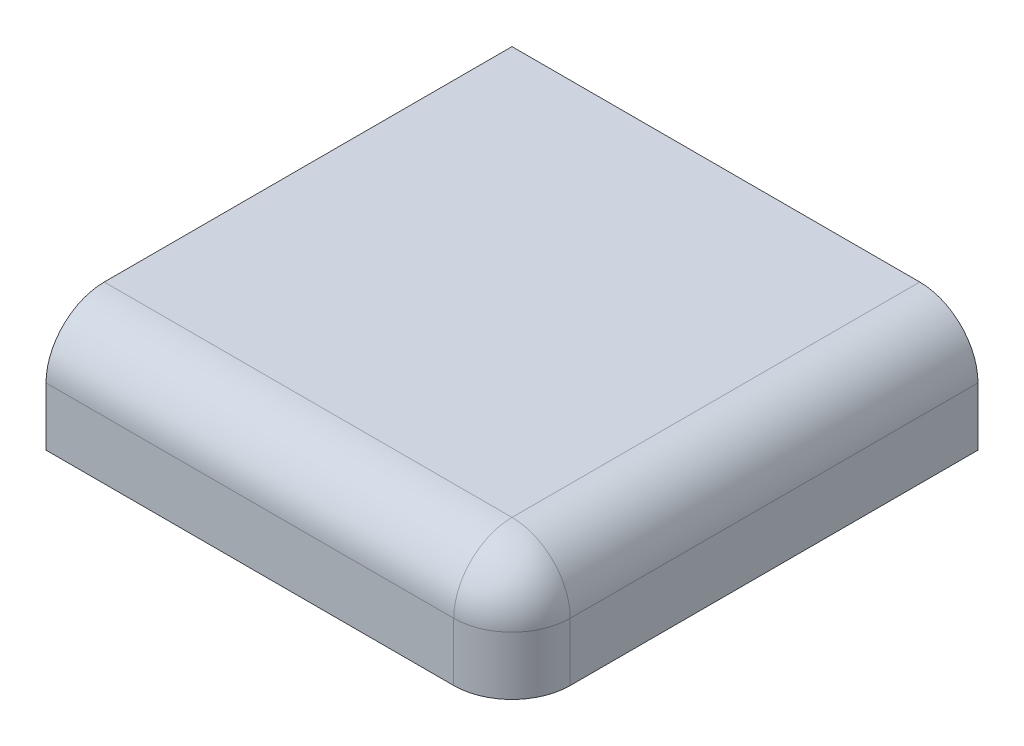
ISO-10303-21;
HEADER;
FILE_DESCRIPTION(('STEP AP214'),'2;1');
FILE_NAME('part.step','',(''),(''),'','','');
FILE_SCHEMA(('AUTOMOTIVE_DESIGN { 1 0 10303 214 1 1 1 1 }'));
ENDSEC;
DATA;
#1=APPLICATION_CONTEXT('core data for automotive mechanical design processes');
#2=APPLICATION_PROTOCOL_DEFINITION('international standard','automotive_design',2000,#1);
#3=PRODUCT_CONTEXT('',#1,'mechanical');
#4=PRODUCT('Part','Part','',(#3));
#5=PRODUCT_RELATED_PRODUCT_CATEGORY('part','',(#4));
#6=PRODUCT_DEFINITION_FORMATION('','',#4);
#7=PRODUCT_DEFINITION_CONTEXT('part definition',#1,'design');
#8=PRODUCT_DEFINITION('design','',#6,#7);
#9=PRODUCT_DEFINITION_SHAPE('','',#8);
#10=(LENGTH_UNIT() NAMED_UNIT(*) SI_UNIT(.MILLI.,.METRE.));
#11=(NAMED_UNIT(*) PLANE_ANGLE_UNIT() SI_UNIT($,.RADIAN.));
#12=(NAMED_UNIT(*) SI_UNIT($,.STERADIAN.) SOLID_ANGLE_UNIT());
#13=UNCERTAINTY_MEASURE_WITH_UNIT(LENGTH_MEASURE(1.E-05),#10,'distance_accuracy_value','');
#14=(GEOMETRIC_REPRESENTATION_CONTEXT(3) GLOBAL_UNCERTAINTY_ASSIGNED_CONTEXT((#13)) GLOBAL_UNIT_ASSIGNED_CONTEXT((#10,
#11,#12)) REPRESENTATION_CONTEXT('',''));
#15=CARTESIAN_POINT('',(0.,0.,0.));
#16=DIRECTION('',(0.,0.,1.));
#17=DIRECTION('',(1.,0.,0.));
#18=AXIS2_PLACEMENT_3D('',#15,#16,#17);
#19=CARTESIAN_POINT('',(-20.,-10.,20.));
#20=DIRECTION('',(-1.,0.,0.));
#21=DIRECTION('',(0.,0.,1.));
#22=AXIS2_PLACEMENT_3D('',#19,#20,#21);
#23=PLANE('',#22);
#24=CARTESIAN_POINT('',(-20.,-5.19917694316328,0.));
#25=DIRECTION('',(-1.,0.,0.));
#26=DIRECTION('',(0.,0.,1.));
#27=AXIS2_PLACEMENT_3D('',#24,#25,#26);
#28=CIRCLE('',#27,2.575);
#29=CARTESIAN_POINT('',(-20.,-2.96916152841835,-1.28749999999999));
#30=VERTEX_POINT('',#29);
#31=CARTESIAN_POINT('',(-20.,-2.96916152841835,1.28749999999999));
#32=VERTEX_POINT('',#31);
#33=EDGE_CURVE('E160',#30,#32,#28,.T.);
#34=ORIENTED_EDGE('',*,*,#33,.F.);
#35=DIRECTION('',(0.,-0.499999999999997,-0.86602540378444));
#36=VECTOR('',#35,1.);
#37=CARTESIAN_POINT('',(-20.,-1.66936729262754,0.963809655774862));
#38=LINE('',#37,#36);
#39=CARTESIAN_POINT('',(-20.,-2.22582305683672,0.));
#40=VERTEX_POINT('',#39);
#41=EDGE_CURVE('E166',#40,#30,#38,.T.);
#42=ORIENTED_EDGE('',*,*,#41,.F.);
#43=DIRECTION('',(0.,-0.499999999999997,0.866025403784441));
#44=VECTOR('',#43,1.);
#45=CARTESIAN_POINT('',(-20.,-1.66936729262755,-0.963809655774862));
#46=LINE('',#45,#44);
#47=EDGE_CURVE('E173',#40,#32,#46,.T.);
#48=ORIENTED_EDGE('',*,*,#47,.T.);
#49=EDGE_LOOP('',(#34,#42,#48));
#50=FACE_BOUND('',#49,.T.);
#51=DIRECTION('',(0.,1.,0.));
#52=VECTOR('',#51,1.);
#53=CARTESIAN_POINT('',(-20.,-10.,20.));
#54=LINE('',#53,#52);
#55=CARTESIAN_POINT('',(-20.,-10.,20.));
#56=VERTEX_POINT('',#55);
#57=CARTESIAN_POINT('',(-20.,-5.,20.));
#58=VERTEX_POINT('',#57);
#59=EDGE_CURVE('E197',#56,#58,#54,.T.);
#60=ORIENTED_EDGE('',*,*,#59,.T.);
#61=CARTESIAN_POINT('',(-20.,-5.,15.));
#62=DIRECTION('',(-1.,0.,0.));
#63=DIRECTION('',(0.,0.,1.));
#64=AXIS2_PLACEMENT_3D('',#61,#62,#63);
#65=CIRCLE('',#64,5.);
#66=CARTESIAN_POINT('',(-20.,0.,15.));
#67=VERTEX_POINT('',#66);
#68=EDGE_CURVE('E217',#58,#67,#65,.T.);
#69=ORIENTED_EDGE('',*,*,#68,.T.);
#70=DIRECTION('',(0.,0.,1.));
#71=VECTOR('',#70,1.);
#72=CARTESIAN_POINT('',(-20.,0.,20.));
#73=LINE('',#72,#71);
#74=CARTESIAN_POINT('',(-20.,0.,-20.));
#75=VERTEX_POINT('',#74);
#76=EDGE_CURVE('E180',#75,#67,#73,.T.);
#77=ORIENTED_EDGE('',*,*,#76,.F.);
#78=DIRECTION('',(0.,1.,0.));
#79=VECTOR('',#78,1.);
#80=CARTESIAN_POINT('',(-20.,-10.,-20.));
#81=LINE('',#80,#79);
#82=CARTESIAN_POINT('',(-20.,-10.,-20.));
#83=VERTEX_POINT('',#82);
#84=EDGE_CURVE('E201',#83,#75,#81,.T.);
#85=ORIENTED_EDGE('',*,*,#84,.F.);
#86=DIRECTION('',(0.,0.,1.));
#87=VECTOR('',#86,1.);
#88=CARTESIAN_POINT('',(-20.,-10.,20.));
#89=LINE('',#88,#87);
#90=EDGE_CURVE('E185',#83,#56,#89,.T.);
#91=ORIENTED_EDGE('',*,*,#90,.T.);
#92=EDGE_LOOP('',(#60,#69,#77,#85,#91));
#93=FACE_BOUND('',#92,.T.);
#94=ADVANCED_FACE('F37',(#50,#93),#23,.T.);
#95=CARTESIAN_POINT('',(-20.,-10.,-20.));
#96=DIRECTION('',(0.,0.,-1.));
#97=DIRECTION('',(-1.,0.,0.));
#98=AXIS2_PLACEMENT_3D('',#95,#96,#97);
#99=PLANE('',#98);
#100=CARTESIAN_POINT('',(0.,-5.19917694316328,-20.));
#101=DIRECTION('',(0.,0.,-1.));
#102=DIRECTION('',(-1.,0.,0.));
#103=AXIS2_PLACEMENT_3D('',#100,#101,#102);
#104=CIRCLE('',#103,2.575);
#105=CARTESIAN_POINT('',(1.28750000000006,-2.96916152841835,-20.));
#106=VERTEX_POINT('',#105);
#107=CARTESIAN_POINT('',(-1.28749999999993,-2.96916152841835,-20.));
#108=VERTEX_POINT('',#107);
#109=EDGE_CURVE('E146',#106,#108,#104,.T.);
#110=ORIENTED_EDGE('',*,*,#109,.F.);
#111=DIRECTION('',(0.86602540378444,-0.499999999999997,0.));
#112=VECTOR('',#111,1.);
#113=CARTESIAN_POINT('',(-0.963809655774792,-1.66936729262754,-20.));
#114=LINE('',#113,#112);
#115=CARTESIAN_POINT('',(0.,-2.22582305683672,-20.));
#116=VERTEX_POINT('',#115);
#117=EDGE_CURVE('E149',#116,#106,#114,.T.);
#118=ORIENTED_EDGE('',*,*,#117,.F.);
#119=DIRECTION('',(-0.866025403784441,-0.499999999999997,0.));
#120=VECTOR('',#119,1.);
#121=CARTESIAN_POINT('',(0.963809655774932,-1.66936729262755,-20.));
#122=LINE('',#121,#120);
#123=EDGE_CURVE('E152',#116,#108,#122,.T.);
#124=ORIENTED_EDGE('',*,*,#123,.T.);
#125=EDGE_LOOP('',(#110,#118,#124));
#126=FACE_BOUND('',#125,.T.);
#127=DIRECTION('',(-1.,0.,0.));
#128=VECTOR('',#127,1.);
#129=CARTESIAN_POINT('',(-20.,0.,-20.));
#130=LINE('',#129,#128);
#131=CARTESIAN_POINT('',(15.,0.,-20.));
#132=VERTEX_POINT('',#131);
#133=EDGE_CURVE('E189',#132,#75,#130,.T.);
#134=ORIENTED_EDGE('',*,*,#133,.F.);
#135=CARTESIAN_POINT('',(15.,-5.,-20.));
#136=DIRECTION('',(0.,0.,-1.));
#137=DIRECTION('',(-1.,0.,0.));
#138=AXIS2_PLACEMENT_3D('',#135,#136,#137);
#139=CIRCLE('',#138,5.);
#140=CARTESIAN_POINT('',(20.,-5.,-20.));
#141=VERTEX_POINT('',#140);
#142=EDGE_CURVE('E219',#132,#141,#139,.T.);
#143=ORIENTED_EDGE('',*,*,#142,.T.);
#144=DIRECTION('',(0.,1.,0.));
#145=VECTOR('',#144,1.);
#146=CARTESIAN_POINT('',(20.,-10.,-20.));
#147=LINE('',#146,#145);
#148=CARTESIAN_POINT('',(20.,-10.,-20.));
#149=VERTEX_POINT('',#148);
#150=EDGE_CURVE('E205',#149,#141,#147,.T.);
#151=ORIENTED_EDGE('',*,*,#150,.F.);
#152=DIRECTION('',(-1.,0.,0.));
#153=VECTOR('',#152,1.);
#154=CARTESIAN_POINT('',(-20.,-10.,-20.));
#155=LINE('',#154,#153);
#156=EDGE_CURVE('E194',#149,#83,#155,.T.);
#157=ORIENTED_EDGE('',*,*,#156,.T.);
#158=ORIENTED_EDGE('',*,*,#84,.T.);
#159=EDGE_LOOP('',(#134,#143,#151,#157,#158));
#160=FACE_BOUND('',#159,.T.);
#161=ADVANCED_FACE('F255',(#126,#160),#99,.T.);
#162=CARTESIAN_POINT('',(20.,-10.,20.));
#163=DIRECTION('',(1.,0.,0.));
#164=DIRECTION('',(0.,0.,-1.));
#165=AXIS2_PLACEMENT_3D('',#162,#163,#164);
#166=PLANE('',#165);
#167=ORIENTED_EDGE('',*,*,#150,.T.);
#168=DIRECTION('',(0.,0.,-1.));
#169=VECTOR('',#168,1.);
#170=CARTESIAN_POINT('',(20.,-5.,20.));
#171=LINE('',#170,#169);
#172=CARTESIAN_POINT('',(20.,-5.,15.));
#173=VERTEX_POINT('',#172);
#174=EDGE_CURVE('E46',#141,#173,#171,.F.);
#175=ORIENTED_EDGE('',*,*,#174,.T.);
#176=DIRECTION('',(0.,1.,0.));
#177=VECTOR('',#176,1.);
#178=CARTESIAN_POINT('',(20.,-10.,15.));
#179=LINE('',#178,#177);
#180=CARTESIAN_POINT('',(20.,-10.,15.));
#181=VERTEX_POINT('',#180);
#182=EDGE_CURVE('E57',#173,#181,#179,.F.);
#183=ORIENTED_EDGE('',*,*,#182,.T.);
#184=DIRECTION('',(0.,0.,-1.));
#185=VECTOR('',#184,1.);
#186=CARTESIAN_POINT('',(20.,-10.,20.));
#187=LINE('',#186,#185);
#188=EDGE_CURVE('E192',#181,#149,#187,.T.);
#189=ORIENTED_EDGE('',*,*,#188,.T.);
#190=EDGE_LOOP('',(#167,#175,#183,#189));
#191=FACE_BOUND('',#190,.T.);
#192=ADVANCED_FACE('F256',(#191),#166,.T.);
#193=CARTESIAN_POINT('',(-20.,-10.,20.));
#194=DIRECTION('',(0.,0.,1.));
#195=DIRECTION('',(1.,0.,0.));
#196=AXIS2_PLACEMENT_3D('',#193,#194,#195);
#197=PLANE('',#196);
#198=DIRECTION('',(0.,1.,0.));
#199=VECTOR('',#198,1.);
#200=CARTESIAN_POINT('',(15.,-10.,20.));
#201=LINE('',#200,#199);
#202=CARTESIAN_POINT('',(15.,-10.,20.));
#203=VERTEX_POINT('',#202);
#204=CARTESIAN_POINT('',(15.,-5.,20.));
#205=VERTEX_POINT('',#204);
#206=EDGE_CURVE('E213',#203,#205,#201,.T.);
#207=ORIENTED_EDGE('',*,*,#206,.T.);
#208=DIRECTION('',(1.,0.,0.));
#209=VECTOR('',#208,1.);
#210=CARTESIAN_POINT('',(-20.,-5.,20.));
#211=LINE('',#210,#209);
#212=EDGE_CURVE('E215',#205,#58,#211,.F.);
#213=ORIENTED_EDGE('',*,*,#212,.T.);
#214=ORIENTED_EDGE('',*,*,#59,.F.);
#215=DIRECTION('',(1.,0.,0.));
#216=VECTOR('',#215,1.);
#217=CARTESIAN_POINT('',(-20.,-10.,20.));
#218=LINE('',#217,#216);
#219=EDGE_CURVE('E188',#56,#203,#218,.T.);
#220=ORIENTED_EDGE('',*,*,#219,.T.);
#221=EDGE_LOOP('',(#207,#213,#214,#220));
#222=FACE_BOUND('',#221,.T.);
#223=ADVANCED_FACE('F245',(#222),#197,.T.);
#224=CARTESIAN_POINT('',(0.,-10.,0.));
#225=DIRECTION('',(0.,-1.,0.));
#226=DIRECTION('',(0.,0.,-1.));
#227=AXIS2_PLACEMENT_3D('',#224,#225,#226);
#228=PLANE('',#227);
#229=ORIENTED_EDGE('',*,*,#188,.F.);
#230=CARTESIAN_POINT('',(15.,-10.,15.));
#231=DIRECTION('',(0.,-1.,0.));
#232=DIRECTION('',(0.,0.,-1.));
#233=AXIS2_PLACEMENT_3D('',#230,#231,#232);
#234=CIRCLE('',#233,5.);
#235=EDGE_CURVE('E11',#181,#203,#234,.T.);
#236=ORIENTED_EDGE('',*,*,#235,.T.);
#237=ORIENTED_EDGE('',*,*,#219,.F.);
#238=ORIENTED_EDGE('',*,*,#90,.F.);
#239=ORIENTED_EDGE('',*,*,#156,.F.);
#240=EDGE_LOOP('',(#229,#236,#237,#238,#239));
#241=FACE_BOUND('',#240,.T.);
#242=ADVANCED_FACE('F252',(#241),#228,.T.);
#243=CARTESIAN_POINT('',(0.,0.,0.));
#244=DIRECTION('',(0.,-1.,0.));
#245=DIRECTION('',(0.,0.,-1.));
#246=AXIS2_PLACEMENT_3D('',#243,#244,#245);
#247=PLANE('',#246);
#248=ORIENTED_EDGE('',*,*,#76,.T.);
#249=DIRECTION('',(1.,0.,0.));
#250=VECTOR('',#249,1.);
#251=CARTESIAN_POINT('',(20.,0.,15.));
#252=LINE('',#251,#250);
#253=CARTESIAN_POINT('',(15.,0.,15.));
#254=VERTEX_POINT('',#253);
#255=EDGE_CURVE('E210',#67,#254,#252,.T.);
#256=ORIENTED_EDGE('',*,*,#255,.T.);
#257=DIRECTION('',(0.,0.,-1.));
#258=VECTOR('',#257,1.);
#259=CARTESIAN_POINT('',(15.,0.,-20.));
#260=LINE('',#259,#258);
#261=EDGE_CURVE('E204',#254,#132,#260,.T.);
#262=ORIENTED_EDGE('',*,*,#261,.T.);
#263=ORIENTED_EDGE('',*,*,#133,.T.);
#264=EDGE_LOOP('',(#248,#256,#262,#263));
#265=FACE_BOUND('',#264,.T.);
#266=ADVANCED_FACE('F238',(#265),#247,.F.);
#267=CARTESIAN_POINT('',(-16.85,-5.19917694316328,0.));
#268=DIRECTION('',(-1.,0.,0.));
#269=DIRECTION('',(0.,0.,1.));
#270=AXIS2_PLACEMENT_3D('',#267,#268,#269);
#271=CYLINDRICAL_SURFACE('',#270,2.575);
#272=ORIENTED_EDGE('',*,*,#33,.T.);
#273=DIRECTION('',(-1.,0.,0.));
#274=VECTOR('',#273,1.);
#275=CARTESIAN_POINT('',(-16.85,-2.96916152841835,1.28749999999999));
#276=LINE('',#275,#274);
#277=CARTESIAN_POINT('',(-16.85,-2.96916152841835,1.28749999999999));
#278=VERTEX_POINT('',#277);
#279=EDGE_CURVE('E171',#278,#32,#276,.T.);
#280=ORIENTED_EDGE('',*,*,#279,.F.);
#281=CARTESIAN_POINT('',(-16.85,-5.19917694316328,0.));
#282=DIRECTION('',(-1.,0.,0.));
#283=DIRECTION('',(0.,0.,1.));
#284=AXIS2_PLACEMENT_3D('',#281,#282,#283);
#285=CIRCLE('',#284,2.575);
#286=CARTESIAN_POINT('',(-16.85,-2.96916152841835,-1.28749999999999));
#287=VERTEX_POINT('',#286);
#288=EDGE_CURVE('E162',#287,#278,#285,.T.);
#289=ORIENTED_EDGE('',*,*,#288,.F.);
#290=DIRECTION('',(-1.,0.,0.));
#291=VECTOR('',#290,1.);
#292=CARTESIAN_POINT('',(-16.85,-2.96916152841835,-1.28749999999999));
#293=LINE('',#292,#291);
#294=EDGE_CURVE('E178',#287,#30,#293,.T.);
#295=ORIENTED_EDGE('',*,*,#294,.T.);
#296=EDGE_LOOP('',(#272,#280,#289,#295));
#297=FACE_BOUND('',#296,.T.);
#298=ADVANCED_FACE('F309',(#297),#271,.F.);
#299=CARTESIAN_POINT('',(-16.85,-1.66936729262754,0.963809655774862));
#300=DIRECTION('',(0.,0.86602540378444,-0.499999999999997));
#301=DIRECTION('',(0.,0.499999999999997,0.86602540378444));
#302=AXIS2_PLACEMENT_3D('',#299,#300,#301);
#303=PLANE('',#302);
#304=ORIENTED_EDGE('',*,*,#41,.T.);
#305=ORIENTED_EDGE('',*,*,#294,.F.);
#306=DIRECTION('',(0.,-0.499999999999997,-0.86602540378444));
#307=VECTOR('',#306,1.);
#308=CARTESIAN_POINT('',(-16.85,-1.66936729262754,0.963809655774862));
#309=LINE('',#308,#307);
#310=CARTESIAN_POINT('',(-16.85,-2.22582305683672,0.));
#311=VERTEX_POINT('',#310);
#312=EDGE_CURVE('E168',#311,#287,#309,.T.);
#313=ORIENTED_EDGE('',*,*,#312,.F.);
#314=DIRECTION('',(-1.,0.,0.));
#315=VECTOR('',#314,1.);
#316=CARTESIAN_POINT('',(-16.85,-2.22582305683672,0.));
#317=LINE('',#316,#315);
#318=EDGE_CURVE('E181',#311,#40,#317,.T.);
#319=ORIENTED_EDGE('',*,*,#318,.T.);
#320=EDGE_LOOP('',(#304,#305,#313,#319));
#321=FACE_BOUND('',#320,.T.);
#322=ADVANCED_FACE('F406',(#321),#303,.F.);
#323=CARTESIAN_POINT('',(-16.85,-1.66936729262755,-0.963809655774862));
#324=DIRECTION('',(0.,-0.86602540378444,-0.499999999999997));
#325=DIRECTION('',(0.,0.499999999999997,-0.866025403784441));
#326=AXIS2_PLACEMENT_3D('',#323,#324,#325);
#327=PLANE('',#326);
#328=ORIENTED_EDGE('',*,*,#47,.F.);
#329=ORIENTED_EDGE('',*,*,#318,.F.);
#330=DIRECTION('',(0.,-0.499999999999997,0.866025403784441));
#331=VECTOR('',#330,1.);
#332=CARTESIAN_POINT('',(-16.85,-1.66936729262755,-0.963809655774862));
#333=LINE('',#332,#331);
#334=EDGE_CURVE('E165',#311,#278,#333,.T.);
#335=ORIENTED_EDGE('',*,*,#334,.T.);
#336=ORIENTED_EDGE('',*,*,#279,.T.);
#337=EDGE_LOOP('',(#328,#329,#335,#336));
#338=FACE_BOUND('',#337,.T.);
#339=ADVANCED_FACE('F395',(#338),#327,.T.);
#340=CARTESIAN_POINT('',(-16.85,0.,0.));
#341=DIRECTION('',(-1.,0.,0.));
#342=DIRECTION('',(0.,0.,1.));
#343=AXIS2_PLACEMENT_3D('',#340,#341,#342);
#344=PLANE('',#343);
#345=ORIENTED_EDGE('',*,*,#288,.T.);
#346=ORIENTED_EDGE('',*,*,#334,.F.);
#347=ORIENTED_EDGE('',*,*,#312,.T.);
#348=EDGE_LOOP('',(#345,#346,#347));
#349=FACE_BOUND('',#348,.T.);
#350=ADVANCED_FACE('F385',(#349),#344,.T.);
#351=CARTESIAN_POINT('',(0.,-5.19917694316328,-16.85));
#352=DIRECTION('',(0.,0.,-1.));
#353=DIRECTION('',(-1.,0.,0.));
#354=AXIS2_PLACEMENT_3D('',#351,#352,#353);
#355=CYLINDRICAL_SURFACE('',#354,2.575);
#356=ORIENTED_EDGE('',*,*,#109,.T.);
#357=DIRECTION('',(0.,0.,-1.));
#358=VECTOR('',#357,1.);
#359=CARTESIAN_POINT('',(-1.28749999999993,-2.96916152841835,-16.85));
#360=LINE('',#359,#358);
#361=CARTESIAN_POINT('',(-1.28749999999993,-2.96916152841835,-16.85));
#362=VERTEX_POINT('',#361);
#363=EDGE_CURVE('E132',#362,#108,#360,.T.);
#364=ORIENTED_EDGE('',*,*,#363,.F.);
#365=CARTESIAN_POINT('',(0.,-5.19917694316328,-16.85));
#366=DIRECTION('',(0.,0.,-1.));
#367=DIRECTION('',(-1.,0.,0.));
#368=AXIS2_PLACEMENT_3D('',#365,#366,#367);
#369=CIRCLE('',#368,2.575);
#370=CARTESIAN_POINT('',(1.28750000000005,-2.96916152841835,-16.85));
#371=VERTEX_POINT('',#370);
#372=EDGE_CURVE('E140',#371,#362,#369,.T.);
#373=ORIENTED_EDGE('',*,*,#372,.F.);
#374=DIRECTION('',(0.,0.,-1.));
#375=VECTOR('',#374,1.);
#376=CARTESIAN_POINT('',(1.28750000000005,-2.96916152841835,-16.85));
#377=LINE('',#376,#375);
#378=EDGE_CURVE('E158',#371,#106,#377,.T.);
#379=ORIENTED_EDGE('',*,*,#378,.T.);
#380=EDGE_LOOP('',(#356,#364,#373,#379));
#381=FACE_BOUND('',#380,.T.);
#382=ADVANCED_FACE('F144',(#381),#355,.F.);
#383=CARTESIAN_POINT('',(-0.963809655774803,-1.66936729262754,-16.85));
#384=DIRECTION('',(0.499999999999997,0.86602540378444,0.));
#385=DIRECTION('',(-0.86602540378444,0.499999999999997,0.));
#386=AXIS2_PLACEMENT_3D('',#383,#384,#385);
#387=PLANE('',#386);
#388=ORIENTED_EDGE('',*,*,#117,.T.);
#389=ORIENTED_EDGE('',*,*,#378,.F.);
#390=DIRECTION('',(0.86602540378444,-0.499999999999997,0.));
#391=VECTOR('',#390,1.);
#392=CARTESIAN_POINT('',(-0.963809655774803,-1.66936729262754,-16.85));
#393=LINE('',#392,#391);
#394=CARTESIAN_POINT('',(0.,-2.22582305683672,-16.85));
#395=VERTEX_POINT('',#394);
#396=EDGE_CURVE('E139',#395,#371,#393,.T.);
#397=ORIENTED_EDGE('',*,*,#396,.F.);
#398=DIRECTION('',(0.,0.,-1.));
#399=VECTOR('',#398,1.);
#400=CARTESIAN_POINT('',(0.,-2.22582305683672,-16.85));
#401=LINE('',#400,#399);
#402=EDGE_CURVE('E134',#395,#116,#401,.T.);
#403=ORIENTED_EDGE('',*,*,#402,.T.);
#404=EDGE_LOOP('',(#388,#389,#397,#403));
#405=FACE_BOUND('',#404,.T.);
#406=ADVANCED_FACE('F365',(#405),#387,.F.);
#407=CARTESIAN_POINT('',(0.963809655774921,-1.66936729262755,-16.85));
#408=DIRECTION('',(0.499999999999997,-0.86602540378444,0.));
#409=DIRECTION('',(0.866025403784441,0.499999999999997,0.));
#410=AXIS2_PLACEMENT_3D('',#407,#408,#409);
#411=PLANE('',#410);
#412=ORIENTED_EDGE('',*,*,#123,.F.);
#413=ORIENTED_EDGE('',*,*,#402,.F.);
#414=DIRECTION('',(-0.866025403784441,-0.499999999999997,0.));
#415=VECTOR('',#414,1.);
#416=CARTESIAN_POINT('',(0.963809655774921,-1.66936729262755,-16.85));
#417=LINE('',#416,#415);
#418=EDGE_CURVE('E128',#395,#362,#417,.T.);
#419=ORIENTED_EDGE('',*,*,#418,.T.);
#420=ORIENTED_EDGE('',*,*,#363,.T.);
#421=EDGE_LOOP('',(#412,#413,#419,#420));
#422=FACE_BOUND('',#421,.T.);
#423=ADVANCED_FACE('F131',(#422),#411,.T.);
#424=CARTESIAN_POINT('',(0.,0.,-16.85));
#425=DIRECTION('',(0.,0.,-1.));
#426=DIRECTION('',(-1.,0.,0.));
#427=AXIS2_PLACEMENT_3D('',#424,#425,#426);
#428=PLANE('',#427);
#429=ORIENTED_EDGE('',*,*,#372,.T.);
#430=ORIENTED_EDGE('',*,*,#418,.F.);
#431=ORIENTED_EDGE('',*,*,#396,.T.);
#432=EDGE_LOOP('',(#429,#430,#431));
#433=FACE_BOUND('',#432,.T.);
#434=ADVANCED_FACE('F148',(#433),#428,.T.);
#435=CARTESIAN_POINT('',(15.,-5.,0.));
#436=DIRECTION('',(0.,0.,1.));
#437=DIRECTION('',(1.,0.,0.));
#438=AXIS2_PLACEMENT_3D('',#435,#436,#437);
#439=CYLINDRICAL_SURFACE('',#438,5.);
#440=ORIENTED_EDGE('',*,*,#142,.F.);
#441=ORIENTED_EDGE('',*,*,#261,.F.);
#442=CARTESIAN_POINT('',(15.,-5.,15.));
#443=DIRECTION('',(0.,0.,1.));
#444=DIRECTION('',(1.,0.,0.));
#445=AXIS2_PLACEMENT_3D('',#442,#443,#444);
#446=CIRCLE('',#445,5.);
#447=EDGE_CURVE('E41',#173,#254,#446,.T.);
#448=ORIENTED_EDGE('',*,*,#447,.F.);
#449=ORIENTED_EDGE('',*,*,#174,.F.);
#450=EDGE_LOOP('',(#440,#441,#448,#449));
#451=FACE_BOUND('',#450,.T.);
#452=ADVANCED_FACE('F39',(#451),#439,.T.);
#453=CARTESIAN_POINT('',(15.,-10.,15.));
#454=DIRECTION('',(0.,1.,0.));
#455=DIRECTION('',(0.,0.,1.));
#456=AXIS2_PLACEMENT_3D('',#453,#454,#455);
#457=CYLINDRICAL_SURFACE('',#456,5.);
#458=ORIENTED_EDGE('',*,*,#235,.F.);
#459=ORIENTED_EDGE('',*,*,#182,.F.);
#460=CARTESIAN_POINT('',(15.,-5.,15.));
#461=DIRECTION('',(0.,1.,0.));
#462=DIRECTION('',(0.,0.,1.));
#463=AXIS2_PLACEMENT_3D('',#460,#461,#462);
#464=CIRCLE('',#463,5.);
#465=EDGE_CURVE('E224',#205,#173,#464,.T.);
#466=ORIENTED_EDGE('',*,*,#465,.F.);
#467=ORIENTED_EDGE('',*,*,#206,.F.);
#468=EDGE_LOOP('',(#458,#459,#466,#467));
#469=FACE_BOUND('',#468,.T.);
#470=ADVANCED_FACE('F259',(#469),#457,.T.);
#471=CARTESIAN_POINT('',(15.,-5.,15.));
#472=DIRECTION('',(1.,0.,0.));
#473=DIRECTION('',(0.,0.,-1.));
#474=AXIS2_PLACEMENT_3D('',#471,#472,#473);
#475=SPHERICAL_SURFACE('',#474,5.);
#476=ORIENTED_EDGE('',*,*,#465,.T.);
#477=ORIENTED_EDGE('',*,*,#447,.T.);
#478=CARTESIAN_POINT('',(15.,-5.,15.));
#479=DIRECTION('',(1.,0.,0.));
#480=DIRECTION('',(0.,0.,-1.));
#481=AXIS2_PLACEMENT_3D('',#478,#479,#480);
#482=CIRCLE('',#481,5.);
#483=EDGE_CURVE('E223',#205,#254,#482,.F.);
#484=ORIENTED_EDGE('',*,*,#483,.F.);
#485=EDGE_LOOP('',(#476,#477,#484));
#486=FACE_BOUND('',#485,.T.);
#487=ADVANCED_FACE('F232',(#486),#475,.T.);
#488=CARTESIAN_POINT('',(0.,-5.,15.));
#489=DIRECTION('',(-1.,0.,0.));
#490=DIRECTION('',(0.,0.,1.));
#491=AXIS2_PLACEMENT_3D('',#488,#489,#490);
#492=CYLINDRICAL_SURFACE('',#491,5.);
#493=ORIENTED_EDGE('',*,*,#68,.F.);
#494=ORIENTED_EDGE('',*,*,#212,.F.);
#495=ORIENTED_EDGE('',*,*,#483,.T.);
#496=ORIENTED_EDGE('',*,*,#255,.F.);
#497=EDGE_LOOP('',(#493,#494,#495,#496));
#498=FACE_BOUND('',#497,.T.);
#499=ADVANCED_FACE('F242',(#498),#492,.T.);
#500=CLOSED_SHELL('',(#94,#161,#192,#223,#242,#266,#298,#322,#339,#350,#382,#406,#423,#434,#452,
#470,#487,#499));
#501=MANIFOLD_SOLID_BREP('B2',#500);
#502=ADVANCED_BREP_SHAPE_REPRESENTATION('',(#18,#501),#14);
#503=SHAPE_DEFINITION_REPRESENTATION(#9,#502);
ENDSEC;
END-ISO-10303-21;
